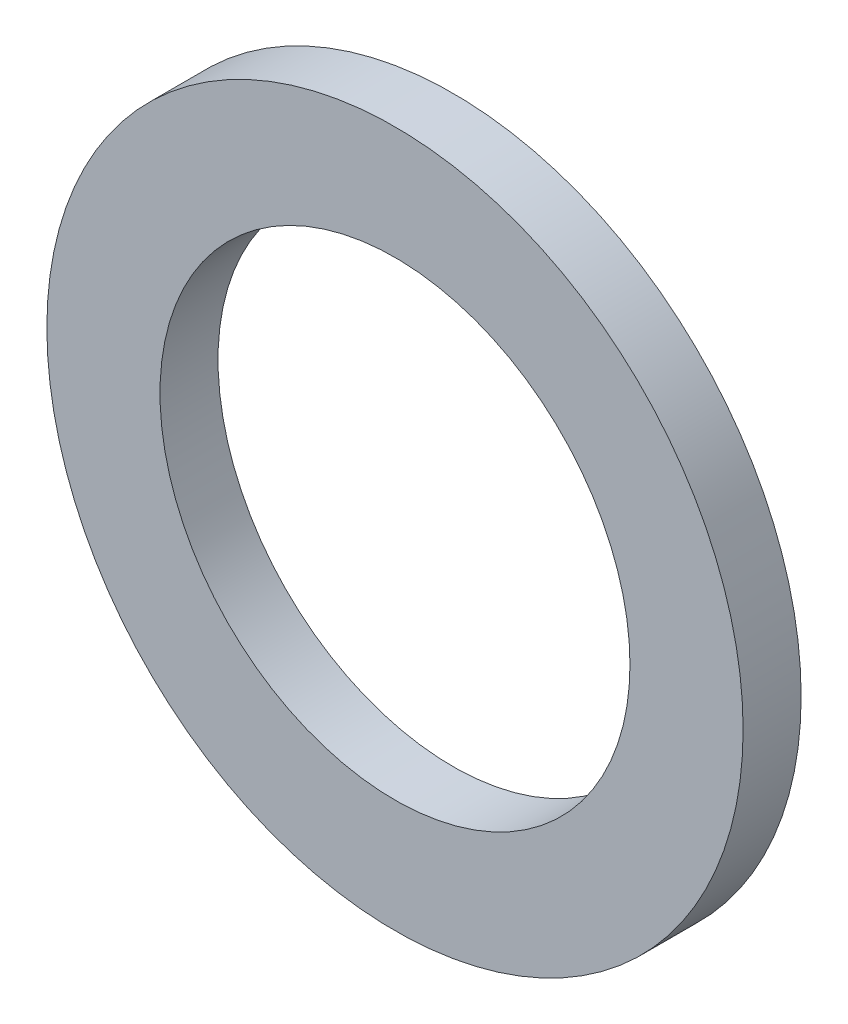
ISO-10303-21;
HEADER;
FILE_DESCRIPTION(('STEP AP214'),'2;1');
FILE_NAME('part.step','',(''),(''),'','','');
FILE_SCHEMA(('AUTOMOTIVE_DESIGN { 1 0 10303 214 1 1 1 1 }'));
ENDSEC;
DATA;
#1=APPLICATION_CONTEXT('core data for automotive mechanical design processes');
#2=APPLICATION_PROTOCOL_DEFINITION('international standard','automotive_design',2000,#1);
#3=PRODUCT_CONTEXT('',#1,'mechanical');
#4=PRODUCT('Part','Part','',(#3));
#5=PRODUCT_RELATED_PRODUCT_CATEGORY('part','',(#4));
#6=PRODUCT_DEFINITION_FORMATION('','',#4);
#7=PRODUCT_DEFINITION_CONTEXT('part definition',#1,'design');
#8=PRODUCT_DEFINITION('design','',#6,#7);
#9=PRODUCT_DEFINITION_SHAPE('','',#8);
#10=(LENGTH_UNIT() NAMED_UNIT(*) SI_UNIT(.MILLI.,.METRE.));
#11=(NAMED_UNIT(*) PLANE_ANGLE_UNIT() SI_UNIT($,.RADIAN.));
#12=(NAMED_UNIT(*) SI_UNIT($,.STERADIAN.) SOLID_ANGLE_UNIT());
#13=UNCERTAINTY_MEASURE_WITH_UNIT(LENGTH_MEASURE(1.E-05),#10,'distance_accuracy_value','');
#14=(GEOMETRIC_REPRESENTATION_CONTEXT(3) GLOBAL_UNCERTAINTY_ASSIGNED_CONTEXT((#13)) GLOBAL_UNIT_ASSIGNED_CONTEXT((#10,
#11,#12)) REPRESENTATION_CONTEXT('',''));
#15=CARTESIAN_POINT('',(0.,0.,0.));
#16=DIRECTION('',(0.,0.,1.));
#17=DIRECTION('',(1.,0.,0.));
#18=AXIS2_PLACEMENT_3D('',#15,#16,#17);
#19=CARTESIAN_POINT('',(0.,0.,1.));
#20=DIRECTION('',(0.,0.,1.));
#21=DIRECTION('',(1.,0.,0.));
#22=AXIS2_PLACEMENT_3D('',#19,#20,#21);
#23=PLANE('',#22);
#24=CARTESIAN_POINT('',(0.,0.,1.));
#25=DIRECTION('',(0.,0.,1.));
#26=DIRECTION('',(1.,0.,0.));
#27=AXIS2_PLACEMENT_3D('',#24,#25,#26);
#28=CIRCLE('',#27,6.);
#29=CARTESIAN_POINT('',(6.,0.,1.));
#30=VERTEX_POINT('',#29);
#31=EDGE_CURVE('E10',#30,#30,#28,.T.);
#32=ORIENTED_EDGE('',*,*,#31,.T.);
#33=EDGE_LOOP('',(#32));
#34=FACE_BOUND('',#33,.T.);
#35=CARTESIAN_POINT('',(0.,0.,1.));
#36=DIRECTION('',(0.,0.,1.));
#37=DIRECTION('',(1.,0.,0.));
#38=AXIS2_PLACEMENT_3D('',#35,#36,#37);
#39=CIRCLE('',#38,4.05);
#40=CARTESIAN_POINT('',(4.05,0.,1.));
#41=VERTEX_POINT('',#40);
#42=EDGE_CURVE('E52',#41,#41,#39,.T.);
#43=ORIENTED_EDGE('',*,*,#42,.F.);
#44=EDGE_LOOP('',(#43));
#45=FACE_BOUND('',#44,.T.);
#46=ADVANCED_FACE('F41',(#34,#45),#23,.T.);
#47=CARTESIAN_POINT('',(0.,0.,0.));
#48=DIRECTION('',(0.,0.,1.));
#49=DIRECTION('',(1.,0.,0.));
#50=AXIS2_PLACEMENT_3D('',#47,#48,#49);
#51=PLANE('',#50);
#52=CARTESIAN_POINT('',(0.,0.,0.));
#53=DIRECTION('',(0.,0.,1.));
#54=DIRECTION('',(1.,0.,0.));
#55=AXIS2_PLACEMENT_3D('',#52,#53,#54);
#56=CIRCLE('',#55,6.);
#57=CARTESIAN_POINT('',(6.,0.,0.));
#58=VERTEX_POINT('',#57);
#59=EDGE_CURVE('E45',#58,#58,#56,.T.);
#60=ORIENTED_EDGE('',*,*,#59,.F.);
#61=EDGE_LOOP('',(#60));
#62=FACE_BOUND('',#61,.T.);
#63=CARTESIAN_POINT('',(0.,0.,0.));
#64=DIRECTION('',(0.,0.,1.));
#65=DIRECTION('',(1.,0.,0.));
#66=AXIS2_PLACEMENT_3D('',#63,#64,#65);
#67=CIRCLE('',#66,4.05);
#68=CARTESIAN_POINT('',(4.05,0.,0.));
#69=VERTEX_POINT('',#68);
#70=EDGE_CURVE('E54',#69,#69,#67,.T.);
#71=ORIENTED_EDGE('',*,*,#70,.T.);
#72=EDGE_LOOP('',(#71));
#73=FACE_BOUND('',#72,.T.);
#74=ADVANCED_FACE('F64',(#62,#73),#51,.F.);
#75=CARTESIAN_POINT('',(0.,0.,1.));
#76=DIRECTION('',(0.,0.,-1.));
#77=DIRECTION('',(-1.,0.,0.));
#78=AXIS2_PLACEMENT_3D('',#75,#76,#77);
#79=CYLINDRICAL_SURFACE('',#78,6.);
#80=ORIENTED_EDGE('',*,*,#31,.F.);
#81=EDGE_LOOP('',(#80));
#82=FACE_BOUND('',#81,.T.);
#83=ORIENTED_EDGE('',*,*,#59,.T.);
#84=EDGE_LOOP('',(#83));
#85=FACE_BOUND('',#84,.T.);
#86=ADVANCED_FACE('F43',(#82,#85),#79,.T.);
#87=CARTESIAN_POINT('',(0.,0.,1.));
#88=DIRECTION('',(0.,0.,-1.));
#89=DIRECTION('',(-1.,0.,0.));
#90=AXIS2_PLACEMENT_3D('',#87,#88,#89);
#91=CYLINDRICAL_SURFACE('',#90,4.05);
#92=ORIENTED_EDGE('',*,*,#42,.T.);
#93=EDGE_LOOP('',(#92));
#94=FACE_BOUND('',#93,.T.);
#95=ORIENTED_EDGE('',*,*,#70,.F.);
#96=EDGE_LOOP('',(#95));
#97=FACE_BOUND('',#96,.T.);
#98=ADVANCED_FACE('F60',(#94,#97),#91,.F.);
#99=CLOSED_SHELL('',(#46,#74,#86,#98));
#100=MANIFOLD_SOLID_BREP('B2',#99);
#101=ADVANCED_BREP_SHAPE_REPRESENTATION('',(#18,#100),#14);
#102=SHAPE_DEFINITION_REPRESENTATION(#9,#101);
ENDSEC;
END-ISO-10303-21;
